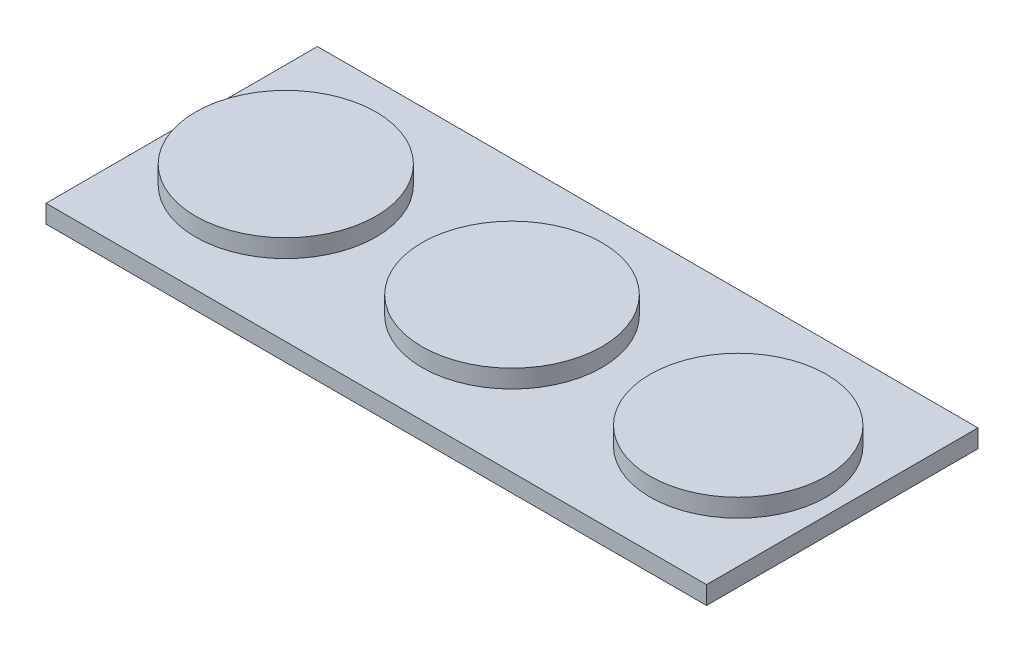
ISO-10303-21;
HEADER;
FILE_DESCRIPTION(('STEP AP214'),'2;1');
FILE_NAME('part.step','',(''),(''),'','','');
FILE_SCHEMA(('AUTOMOTIVE_DESIGN { 1 0 10303 214 1 1 1 1 }'));
ENDSEC;
DATA;
#1=APPLICATION_CONTEXT('core data for automotive mechanical design processes');
#2=APPLICATION_PROTOCOL_DEFINITION('international standard','automotive_design',2000,#1);
#3=PRODUCT_CONTEXT('',#1,'mechanical');
#4=PRODUCT('Part','Part','',(#3));
#5=PRODUCT_RELATED_PRODUCT_CATEGORY('part','',(#4));
#6=PRODUCT_DEFINITION_FORMATION('','',#4);
#7=PRODUCT_DEFINITION_CONTEXT('part definition',#1,'design');
#8=PRODUCT_DEFINITION('design','',#6,#7);
#9=PRODUCT_DEFINITION_SHAPE('','',#8);
#10=(LENGTH_UNIT() NAMED_UNIT(*) SI_UNIT(.MILLI.,.METRE.));
#11=(NAMED_UNIT(*) PLANE_ANGLE_UNIT() SI_UNIT($,.RADIAN.));
#12=(NAMED_UNIT(*) SI_UNIT($,.STERADIAN.) SOLID_ANGLE_UNIT());
#13=UNCERTAINTY_MEASURE_WITH_UNIT(LENGTH_MEASURE(1.E-05),#10,'distance_accuracy_value','');
#14=(GEOMETRIC_REPRESENTATION_CONTEXT(3) GLOBAL_UNCERTAINTY_ASSIGNED_CONTEXT((#13)) GLOBAL_UNIT_ASSIGNED_CONTEXT((#10,
#11,#12)) REPRESENTATION_CONTEXT('',''));
#15=CARTESIAN_POINT('',(0.,0.,0.));
#16=DIRECTION('',(0.,0.,1.));
#17=DIRECTION('',(1.,0.,0.));
#18=AXIS2_PLACEMENT_3D('',#15,#16,#17);
#19=CARTESIAN_POINT('',(36.5,2.,15.));
#20=DIRECTION('',(-1.,0.,0.));
#21=DIRECTION('',(0.,0.,1.));
#22=AXIS2_PLACEMENT_3D('',#19,#20,#21);
#23=PLANE('',#22);
#24=DIRECTION('',(0.,0.,-1.));
#25=VECTOR('',#24,1.);
#26=CARTESIAN_POINT('',(36.5,0.,15.));
#27=LINE('',#26,#25);
#28=CARTESIAN_POINT('',(36.5,0.,15.));
#29=VERTEX_POINT('',#28);
#30=CARTESIAN_POINT('',(36.5,0.,-15.));
#31=VERTEX_POINT('',#30);
#32=EDGE_CURVE('E100',#29,#31,#27,.T.);
#33=ORIENTED_EDGE('',*,*,#32,.T.);
#34=DIRECTION('',(0.,-1.,0.));
#35=VECTOR('',#34,1.);
#36=CARTESIAN_POINT('',(36.5,2.,-15.));
#37=LINE('',#36,#35);
#38=CARTESIAN_POINT('',(36.5,2.,-15.));
#39=VERTEX_POINT('',#38);
#40=EDGE_CURVE('E91',#39,#31,#37,.T.);
#41=ORIENTED_EDGE('',*,*,#40,.F.);
#42=DIRECTION('',(0.,0.,-1.));
#43=VECTOR('',#42,1.);
#44=CARTESIAN_POINT('',(36.5,2.,15.));
#45=LINE('',#44,#43);
#46=CARTESIAN_POINT('',(36.5,2.,15.));
#47=VERTEX_POINT('',#46);
#48=EDGE_CURVE('E85',#47,#39,#45,.T.);
#49=ORIENTED_EDGE('',*,*,#48,.F.);
#50=DIRECTION('',(0.,-1.,0.));
#51=VECTOR('',#50,1.);
#52=CARTESIAN_POINT('',(36.5,2.,15.));
#53=LINE('',#52,#51);
#54=EDGE_CURVE('E96',#47,#29,#53,.T.);
#55=ORIENTED_EDGE('',*,*,#54,.T.);
#56=EDGE_LOOP('',(#33,#41,#49,#55));
#57=FACE_BOUND('',#56,.T.);
#58=ADVANCED_FACE('F33',(#57),#23,.F.);
#59=CARTESIAN_POINT('',(-36.5,2.,-15.));
#60=DIRECTION('',(0.,0.,1.));
#61=DIRECTION('',(1.,0.,0.));
#62=AXIS2_PLACEMENT_3D('',#59,#60,#61);
#63=PLANE('',#62);
#64=DIRECTION('',(-1.,0.,0.));
#65=VECTOR('',#64,1.);
#66=CARTESIAN_POINT('',(-36.5,0.,-15.));
#67=LINE('',#66,#65);
#68=CARTESIAN_POINT('',(-36.5,0.,-15.));
#69=VERTEX_POINT('',#68);
#70=EDGE_CURVE('E90',#31,#69,#67,.T.);
#71=ORIENTED_EDGE('',*,*,#70,.T.);
#72=DIRECTION('',(0.,-1.,0.));
#73=VECTOR('',#72,1.);
#74=CARTESIAN_POINT('',(-36.5,2.,-15.));
#75=LINE('',#74,#73);
#76=CARTESIAN_POINT('',(-36.5,2.,-15.));
#77=VERTEX_POINT('',#76);
#78=EDGE_CURVE('E88',#77,#69,#75,.T.);
#79=ORIENTED_EDGE('',*,*,#78,.F.);
#80=DIRECTION('',(-1.,0.,0.));
#81=VECTOR('',#80,1.);
#82=CARTESIAN_POINT('',(-36.5,2.,-15.));
#83=LINE('',#82,#81);
#84=EDGE_CURVE('E80',#39,#77,#83,.T.);
#85=ORIENTED_EDGE('',*,*,#84,.F.);
#86=ORIENTED_EDGE('',*,*,#40,.T.);
#87=EDGE_LOOP('',(#71,#79,#85,#86));
#88=FACE_BOUND('',#87,.T.);
#89=ADVANCED_FACE('F89',(#88),#63,.F.);
#90=CARTESIAN_POINT('',(-36.5,2.,15.));
#91=DIRECTION('',(1.,0.,0.));
#92=DIRECTION('',(0.,0.,-1.));
#93=AXIS2_PLACEMENT_3D('',#90,#91,#92);
#94=PLANE('',#93);
#95=DIRECTION('',(0.,0.,1.));
#96=VECTOR('',#95,1.);
#97=CARTESIAN_POINT('',(-36.5,0.,15.));
#98=LINE('',#97,#96);
#99=CARTESIAN_POINT('',(-36.5,0.,15.));
#100=VERTEX_POINT('',#99);
#101=EDGE_CURVE('E66',#69,#100,#98,.T.);
#102=ORIENTED_EDGE('',*,*,#101,.T.);
#103=DIRECTION('',(0.,-1.,0.));
#104=VECTOR('',#103,1.);
#105=CARTESIAN_POINT('',(-36.5,2.,15.));
#106=LINE('',#105,#104);
#107=CARTESIAN_POINT('',(-36.5,2.,15.));
#108=VERTEX_POINT('',#107);
#109=EDGE_CURVE('E92',#108,#100,#106,.T.);
#110=ORIENTED_EDGE('',*,*,#109,.F.);
#111=DIRECTION('',(0.,0.,1.));
#112=VECTOR('',#111,1.);
#113=CARTESIAN_POINT('',(-36.5,2.,15.));
#114=LINE('',#113,#112);
#115=EDGE_CURVE('E83',#77,#108,#114,.T.);
#116=ORIENTED_EDGE('',*,*,#115,.F.);
#117=ORIENTED_EDGE('',*,*,#78,.T.);
#118=EDGE_LOOP('',(#102,#110,#116,#117));
#119=FACE_BOUND('',#118,.T.);
#120=ADVANCED_FACE('F94',(#119),#94,.F.);
#121=CARTESIAN_POINT('',(-36.5,2.,15.));
#122=DIRECTION('',(0.,0.,-1.));
#123=DIRECTION('',(-1.,0.,0.));
#124=AXIS2_PLACEMENT_3D('',#121,#122,#123);
#125=PLANE('',#124);
#126=DIRECTION('',(1.,0.,0.));
#127=VECTOR('',#126,1.);
#128=CARTESIAN_POINT('',(-36.5,0.,15.));
#129=LINE('',#128,#127);
#130=EDGE_CURVE('E72',#100,#29,#129,.T.);
#131=ORIENTED_EDGE('',*,*,#130,.T.);
#132=ORIENTED_EDGE('',*,*,#54,.F.);
#133=DIRECTION('',(1.,0.,0.));
#134=VECTOR('',#133,1.);
#135=CARTESIAN_POINT('',(-36.5,2.,15.));
#136=LINE('',#135,#134);
#137=EDGE_CURVE('E49',#108,#47,#136,.T.);
#138=ORIENTED_EDGE('',*,*,#137,.F.);
#139=ORIENTED_EDGE('',*,*,#109,.T.);
#140=EDGE_LOOP('',(#131,#132,#138,#139));
#141=FACE_BOUND('',#140,.T.);
#142=ADVANCED_FACE('F120',(#141),#125,.F.);
#143=CARTESIAN_POINT('',(0.,2.,0.));
#144=DIRECTION('',(0.,-1.,0.));
#145=DIRECTION('',(0.,0.,-1.));
#146=AXIS2_PLACEMENT_3D('',#143,#144,#145);
#147=PLANE('',#146);
#148=CARTESIAN_POINT('',(25.,2.,0.));
#149=DIRECTION('',(0.,-1.,0.));
#150=DIRECTION('',(0.,0.,-1.));
#151=AXIS2_PLACEMENT_3D('',#148,#149,#150);
#152=CIRCLE('',#151,9.75);
#153=CARTESIAN_POINT('',(25.,2.,-9.75));
#154=VERTEX_POINT('',#153);
#155=EDGE_CURVE('E11',#154,#154,#152,.F.);
#156=ORIENTED_EDGE('',*,*,#155,.F.);
#157=EDGE_LOOP('',(#156));
#158=FACE_BOUND('',#157,.T.);
#159=CARTESIAN_POINT('',(0.,2.,0.));
#160=DIRECTION('',(0.,-1.,0.));
#161=DIRECTION('',(0.,0.,-1.));
#162=AXIS2_PLACEMENT_3D('',#159,#160,#161);
#163=CIRCLE('',#162,9.95);
#164=CARTESIAN_POINT('',(0.,2.,-9.95));
#165=VERTEX_POINT('',#164);
#166=EDGE_CURVE('E41',#165,#165,#163,.F.);
#167=ORIENTED_EDGE('',*,*,#166,.F.);
#168=EDGE_LOOP('',(#167));
#169=FACE_BOUND('',#168,.T.);
#170=CARTESIAN_POINT('',(-25.,2.,0.));
#171=DIRECTION('',(0.,-1.,0.));
#172=DIRECTION('',(0.,0.,-1.));
#173=AXIS2_PLACEMENT_3D('',#170,#171,#172);
#174=CIRCLE('',#173,9.975);
#175=CARTESIAN_POINT('',(-25.,2.,-9.975));
#176=VERTEX_POINT('',#175);
#177=EDGE_CURVE('E110',#176,#176,#174,.F.);
#178=ORIENTED_EDGE('',*,*,#177,.F.);
#179=EDGE_LOOP('',(#178));
#180=FACE_BOUND('',#179,.T.);
#181=ORIENTED_EDGE('',*,*,#48,.T.);
#182=ORIENTED_EDGE('',*,*,#84,.T.);
#183=ORIENTED_EDGE('',*,*,#115,.T.);
#184=ORIENTED_EDGE('',*,*,#137,.T.);
#185=EDGE_LOOP('',(#181,#182,#183,#184));
#186=FACE_BOUND('',#185,.T.);
#187=ADVANCED_FACE('F81',(#158,#169,#180,#186),#147,.F.);
#188=CARTESIAN_POINT('',(0.,0.,0.));
#189=DIRECTION('',(0.,-1.,0.));
#190=DIRECTION('',(0.,0.,-1.));
#191=AXIS2_PLACEMENT_3D('',#188,#189,#190);
#192=PLANE('',#191);
#193=ORIENTED_EDGE('',*,*,#32,.F.);
#194=ORIENTED_EDGE('',*,*,#130,.F.);
#195=ORIENTED_EDGE('',*,*,#101,.F.);
#196=ORIENTED_EDGE('',*,*,#70,.F.);
#197=EDGE_LOOP('',(#193,#194,#195,#196));
#198=FACE_BOUND('',#197,.T.);
#199=ADVANCED_FACE('F119',(#198),#192,.T.);
#200=CARTESIAN_POINT('',(-25.,4.,0.));
#201=DIRECTION('',(0.,-1.,0.));
#202=DIRECTION('',(0.,0.,-1.));
#203=AXIS2_PLACEMENT_3D('',#200,#201,#202);
#204=CYLINDRICAL_SURFACE('',#203,9.975);
#205=CARTESIAN_POINT('',(-25.,4.,0.));
#206=DIRECTION('',(0.,1.,0.));
#207=DIRECTION('',(0.,0.,1.));
#208=AXIS2_PLACEMENT_3D('',#205,#206,#207);
#209=CIRCLE('',#208,9.975);
#210=CARTESIAN_POINT('',(-25.,4.,9.975));
#211=VERTEX_POINT('',#210);
#212=EDGE_CURVE('E103',#211,#211,#209,.T.);
#213=ORIENTED_EDGE('',*,*,#212,.F.);
#214=EDGE_LOOP('',(#213));
#215=FACE_BOUND('',#214,.T.);
#216=ORIENTED_EDGE('',*,*,#177,.T.);
#217=EDGE_LOOP('',(#216));
#218=FACE_BOUND('',#217,.T.);
#219=ADVANCED_FACE('F125',(#215,#218),#204,.T.);
#220=CARTESIAN_POINT('',(-25.,4.,0.));
#221=DIRECTION('',(0.,1.,0.));
#222=DIRECTION('',(0.,0.,1.));
#223=AXIS2_PLACEMENT_3D('',#220,#221,#222);
#224=PLANE('',#223);
#225=ORIENTED_EDGE('',*,*,#212,.T.);
#226=EDGE_LOOP('',(#225));
#227=FACE_BOUND('',#226,.T.);
#228=ADVANCED_FACE('F127',(#227),#224,.T.);
#229=CARTESIAN_POINT('',(0.,4.,0.));
#230=DIRECTION('',(0.,-1.,0.));
#231=DIRECTION('',(0.,0.,-1.));
#232=AXIS2_PLACEMENT_3D('',#229,#230,#231);
#233=CYLINDRICAL_SURFACE('',#232,9.95);
#234=CARTESIAN_POINT('',(0.,4.,0.));
#235=DIRECTION('',(0.,1.,0.));
#236=DIRECTION('',(0.,0.,1.));
#237=AXIS2_PLACEMENT_3D('',#234,#235,#236);
#238=CIRCLE('',#237,9.95);
#239=CARTESIAN_POINT('',(0.,4.,9.95));
#240=VERTEX_POINT('',#239);
#241=EDGE_CURVE('E233',#240,#240,#238,.T.);
#242=ORIENTED_EDGE('',*,*,#241,.F.);
#243=EDGE_LOOP('',(#242));
#244=FACE_BOUND('',#243,.T.);
#245=ORIENTED_EDGE('',*,*,#166,.T.);
#246=EDGE_LOOP('',(#245));
#247=FACE_BOUND('',#246,.T.);
#248=ADVANCED_FACE('F115',(#244,#247),#233,.T.);
#249=CARTESIAN_POINT('',(0.,4.,0.));
#250=DIRECTION('',(0.,1.,0.));
#251=DIRECTION('',(0.,0.,1.));
#252=AXIS2_PLACEMENT_3D('',#249,#250,#251);
#253=PLANE('',#252);
#254=ORIENTED_EDGE('',*,*,#241,.T.);
#255=EDGE_LOOP('',(#254));
#256=FACE_BOUND('',#255,.T.);
#257=ADVANCED_FACE('F196',(#256),#253,.T.);
#258=CARTESIAN_POINT('',(25.,4.,0.));
#259=DIRECTION('',(0.,-1.,0.));
#260=DIRECTION('',(0.,0.,-1.));
#261=AXIS2_PLACEMENT_3D('',#258,#259,#260);
#262=CYLINDRICAL_SURFACE('',#261,9.75);
#263=CARTESIAN_POINT('',(25.,4.,0.));
#264=DIRECTION('',(0.,1.,0.));
#265=DIRECTION('',(0.,0.,1.));
#266=AXIS2_PLACEMENT_3D('',#263,#264,#265);
#267=CIRCLE('',#266,9.75);
#268=CARTESIAN_POINT('',(25.,4.,9.75));
#269=VERTEX_POINT('',#268);
#270=EDGE_CURVE('E232',#269,#269,#267,.T.);
#271=ORIENTED_EDGE('',*,*,#270,.F.);
#272=EDGE_LOOP('',(#271));
#273=FACE_BOUND('',#272,.T.);
#274=ORIENTED_EDGE('',*,*,#155,.T.);
#275=EDGE_LOOP('',(#274));
#276=FACE_BOUND('',#275,.T.);
#277=ADVANCED_FACE('F205',(#273,#276),#262,.T.);
#278=CARTESIAN_POINT('',(25.,4.,0.));
#279=DIRECTION('',(0.,1.,0.));
#280=DIRECTION('',(0.,0.,1.));
#281=AXIS2_PLACEMENT_3D('',#278,#279,#280);
#282=PLANE('',#281);
#283=ORIENTED_EDGE('',*,*,#270,.T.);
#284=EDGE_LOOP('',(#283));
#285=FACE_BOUND('',#284,.T.);
#286=ADVANCED_FACE('F214',(#285),#282,.T.);
#287=CLOSED_SHELL('',(#58,#89,#120,#142,#187,#199,#219,#228,#248,#257,#277,#286));
#288=MANIFOLD_SOLID_BREP('B2',#287);
#289=ADVANCED_BREP_SHAPE_REPRESENTATION('',(#18,#288),#14);
#290=SHAPE_DEFINITION_REPRESENTATION(#9,#289);
ENDSEC;
END-ISO-10303-21;
